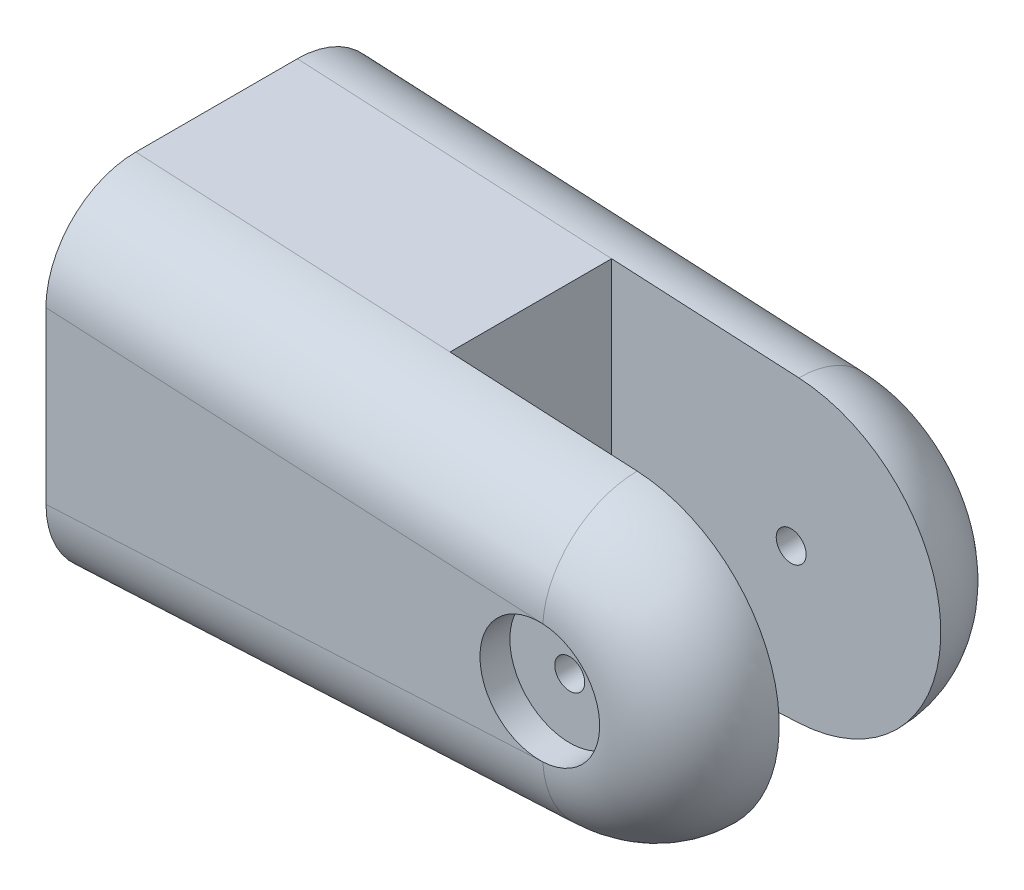
ISO-10303-21;
HEADER;
FILE_DESCRIPTION(('STEP AP214'),'2;1');
FILE_NAME('part.step','',(''),(''),'','','');
FILE_SCHEMA(('AUTOMOTIVE_DESIGN { 1 0 10303 214 1 1 1 1 }'));
ENDSEC;
DATA;
#1=APPLICATION_CONTEXT('core data for automotive mechanical design processes');
#2=APPLICATION_PROTOCOL_DEFINITION('international standard','automotive_design',2000,#1);
#3=PRODUCT_CONTEXT('',#1,'mechanical');
#4=PRODUCT('Part','Part','',(#3));
#5=PRODUCT_RELATED_PRODUCT_CATEGORY('part','',(#4));
#6=PRODUCT_DEFINITION_FORMATION('','',#4);
#7=PRODUCT_DEFINITION_CONTEXT('part definition',#1,'design');
#8=PRODUCT_DEFINITION('design','',#6,#7);
#9=PRODUCT_DEFINITION_SHAPE('','',#8);
#10=(LENGTH_UNIT() NAMED_UNIT(*) SI_UNIT(.MILLI.,.METRE.));
#11=(NAMED_UNIT(*) PLANE_ANGLE_UNIT() SI_UNIT($,.RADIAN.));
#12=(NAMED_UNIT(*) SI_UNIT($,.STERADIAN.) SOLID_ANGLE_UNIT());
#13=UNCERTAINTY_MEASURE_WITH_UNIT(LENGTH_MEASURE(1.E-05),#10,'distance_accuracy_value','');
#14=(GEOMETRIC_REPRESENTATION_CONTEXT(3) GLOBAL_UNCERTAINTY_ASSIGNED_CONTEXT((#13)) GLOBAL_UNIT_ASSIGNED_CONTEXT((#10,
#11,#12)) REPRESENTATION_CONTEXT('',''));
#15=CARTESIAN_POINT('',(0.,0.,0.));
#16=DIRECTION('',(0.,0.,1.));
#17=DIRECTION('',(1.,0.,0.));
#18=AXIS2_PLACEMENT_3D('',#15,#16,#17);
#19=CARTESIAN_POINT('',(0.,0.,57.));
#20=DIRECTION('',(0.,0.,1.));
#21=DIRECTION('',(1.,0.,0.));
#22=AXIS2_PLACEMENT_3D('',#19,#20,#21);
#23=PLANE('',#22);
#24=DIRECTION('',(0.998695955114359,0.0510528083284243,0.));
#25=VECTOR('',#24,1.);
#26=CARTESIAN_POINT('',(1.02105616656849,-19.9739191022872,57.));
#27=LINE('',#26,#25);
#28=CARTESIAN_POINT('',(-165.,-28.4608275708249,57.));
#29=VERTEX_POINT('',#28);
#30=CARTESIAN_POINT('',(1.02105616656849,-19.9739191022872,57.));
#31=VERTEX_POINT('',#30);
#32=EDGE_CURVE('E130',#29,#31,#27,.T.);
#33=ORIENTED_EDGE('',*,*,#32,.T.);
#34=CARTESIAN_POINT('',(0.,0.,57.));
#35=DIRECTION('',(0.,0.,-1.));
#36=DIRECTION('',(-1.,0.,0.));
#37=AXIS2_PLACEMENT_3D('',#34,#35,#36);
#38=CIRCLE('',#37,20.);
#39=CARTESIAN_POINT('',(1.02105616656848,19.9739191022872,57.));
#40=VERTEX_POINT('',#39);
#41=EDGE_CURVE('E116',#31,#40,#38,.T.);
#42=ORIENTED_EDGE('',*,*,#41,.T.);
#43=DIRECTION('',(-0.998695955114359,0.0510528083284241,0.));
#44=VECTOR('',#43,1.);
#45=CARTESIAN_POINT('',(-166.531584249853,28.5391213465692,57.));
#46=LINE('',#45,#44);
#47=CARTESIAN_POINT('',(-165.,28.4608275708248,57.));
#48=VERTEX_POINT('',#47);
#49=EDGE_CURVE('E122',#40,#48,#46,.T.);
#50=ORIENTED_EDGE('',*,*,#49,.T.);
#51=DIRECTION('',(0.,-1.,0.));
#52=VECTOR('',#51,1.);
#53=CARTESIAN_POINT('',(-165.,-58.5,57.));
#54=LINE('',#53,#52);
#55=EDGE_CURVE('E192',#48,#29,#54,.T.);
#56=ORIENTED_EDGE('',*,*,#55,.T.);
#57=EDGE_LOOP('',(#33,#42,#50,#56));
#58=FACE_BOUND('',#57,.T.);
#59=ADVANCED_FACE('F35',(#58),#23,.T.);
#60=CARTESIAN_POINT('',(2.5526404164212,49.9347977557179,57.));
#61=DIRECTION('',(-0.0510528083284241,-0.998695955114359,0.));
#62=DIRECTION('',(0.998695955114359,-0.0510528083284241,0.));
#63=AXIS2_PLACEMENT_3D('',#60,#61,#62);
#64=PLANE('',#63);
#65=DIRECTION('',(0.,0.,-1.));
#66=VECTOR('',#65,1.);
#67=CARTESIAN_POINT('',(-60.,53.1324556067009,57.));
#68=LINE('',#67,#66);
#69=CARTESIAN_POINT('',(-60.,53.1324556067009,27.));
#70=VERTEX_POINT('',#69);
#71=CARTESIAN_POINT('',(-60.,53.1324556067009,-27.));
#72=VERTEX_POINT('',#71);
#73=EDGE_CURVE('E176',#70,#72,#68,.T.);
#74=ORIENTED_EDGE('',*,*,#73,.T.);
#75=DIRECTION('',(-0.998695955114359,0.0510528083284241,0.));
#76=VECTOR('',#75,1.);
#77=CARTESIAN_POINT('',(2.5526404164212,49.9347977557179,-27.));
#78=LINE('',#77,#76);
#79=CARTESIAN_POINT('',(-165.,58.5,-27.));
#80=VERTEX_POINT('',#79);
#81=EDGE_CURVE('E12',#72,#80,#78,.T.);
#82=ORIENTED_EDGE('',*,*,#81,.T.);
#83=DIRECTION('',(0.,0.,-1.));
#84=VECTOR('',#83,1.);
#85=CARTESIAN_POINT('',(-165.,58.5,57.));
#86=LINE('',#85,#84);
#87=CARTESIAN_POINT('',(-165.,58.5,27.));
#88=VERTEX_POINT('',#87);
#89=EDGE_CURVE('E191',#88,#80,#86,.T.);
#90=ORIENTED_EDGE('',*,*,#89,.F.);
#91=DIRECTION('',(-0.998695955114359,0.0510528083284241,0.));
#92=VECTOR('',#91,1.);
#93=CARTESIAN_POINT('',(2.5526404164212,49.9347977557179,27.));
#94=LINE('',#93,#92);
#95=EDGE_CURVE('E44',#88,#70,#94,.F.);
#96=ORIENTED_EDGE('',*,*,#95,.T.);
#97=EDGE_LOOP('',(#74,#82,#90,#96));
#98=FACE_BOUND('',#97,.T.);
#99=ADVANCED_FACE('F224',(#98),#64,.F.);
#100=CARTESIAN_POINT('',(-165.,-58.5,57.));
#101=DIRECTION('',(1.,0.,0.));
#102=DIRECTION('',(0.,0.,-1.));
#103=AXIS2_PLACEMENT_3D('',#100,#101,#102);
#104=PLANE('',#103);
#105=CARTESIAN_POINT('',(-165.,0.,0.));
#106=DIRECTION('',(-1.,0.,0.));
#107=DIRECTION('',(0.,0.,1.));
#108=AXIS2_PLACEMENT_3D('',#105,#106,#107);
#109=CIRCLE('',#108,37.5);
#110=CARTESIAN_POINT('',(-165.,0.,37.5));
#111=VERTEX_POINT('',#110);
#112=EDGE_CURVE('E187',#111,#111,#109,.T.);
#113=ORIENTED_EDGE('',*,*,#112,.F.);
#114=EDGE_LOOP('',(#113));
#115=FACE_BOUND('',#114,.T.);
#116=DIRECTION('',(0.,0.,-1.));
#117=VECTOR('',#116,1.);
#118=CARTESIAN_POINT('',(-165.,-58.5,57.));
#119=LINE('',#118,#117);
#120=CARTESIAN_POINT('',(-165.,-58.5,27.));
#121=VERTEX_POINT('',#120);
#122=CARTESIAN_POINT('',(-165.,-58.5,-27.));
#123=VERTEX_POINT('',#122);
#124=EDGE_CURVE('E194',#121,#123,#119,.T.);
#125=ORIENTED_EDGE('',*,*,#124,.F.);
#126=CARTESIAN_POINT('',(-165.,-28.4608275708249,27.));
#127=DIRECTION('',(1.,0.,0.));
#128=DIRECTION('',(0.,-1.,0.));
#129=AXIS2_PLACEMENT_3D('',#126,#127,#128);
#130=ELLIPSE('',#129,30.0391724291752,30.);
#131=EDGE_CURVE('E217',#121,#29,#130,.F.);
#132=ORIENTED_EDGE('',*,*,#131,.T.);
#133=ORIENTED_EDGE('',*,*,#55,.F.);
#134=CARTESIAN_POINT('',(-165.,28.4608275708248,27.));
#135=DIRECTION('',(1.,0.,0.));
#136=DIRECTION('',(0.,-1.,0.));
#137=AXIS2_PLACEMENT_3D('',#134,#135,#136);
#138=ELLIPSE('',#137,30.0391724291752,30.);
#139=EDGE_CURVE('E142',#48,#88,#138,.F.);
#140=ORIENTED_EDGE('',*,*,#139,.T.);
#141=ORIENTED_EDGE('',*,*,#89,.T.);
#142=CARTESIAN_POINT('',(-165.,28.4608275708248,-27.));
#143=DIRECTION('',(1.,0.,0.));
#144=DIRECTION('',(0.,1.,0.));
#145=AXIS2_PLACEMENT_3D('',#142,#143,#144);
#146=ELLIPSE('',#145,30.0391724291752,30.);
#147=CARTESIAN_POINT('',(-165.,28.4608275708248,-57.));
#148=VERTEX_POINT('',#147);
#149=EDGE_CURVE('E213',#80,#148,#146,.F.);
#150=ORIENTED_EDGE('',*,*,#149,.T.);
#151=DIRECTION('',(0.,-1.,0.));
#152=VECTOR('',#151,1.);
#153=CARTESIAN_POINT('',(-165.,-58.5,-57.));
#154=LINE('',#153,#152);
#155=CARTESIAN_POINT('',(-165.,-28.4608275708249,-57.));
#156=VERTEX_POINT('',#155);
#157=EDGE_CURVE('E186',#148,#156,#154,.T.);
#158=ORIENTED_EDGE('',*,*,#157,.T.);
#159=CARTESIAN_POINT('',(-165.,-28.4608275708249,-27.));
#160=DIRECTION('',(1.,0.,0.));
#161=DIRECTION('',(0.,1.,0.));
#162=AXIS2_PLACEMENT_3D('',#159,#160,#161);
#163=ELLIPSE('',#162,30.0391724291752,30.);
#164=EDGE_CURVE('E215',#156,#123,#163,.F.);
#165=ORIENTED_EDGE('',*,*,#164,.T.);
#166=EDGE_LOOP('',(#125,#132,#133,#140,#141,#150,#158,#165));
#167=FACE_BOUND('',#166,.T.);
#168=ADVANCED_FACE('F274',(#115,#167),#104,.F.);
#169=CARTESIAN_POINT('',(2.55264041642122,-49.9347977557179,57.));
#170=DIRECTION('',(-0.0510528083284243,0.998695955114359,0.));
#171=DIRECTION('',(-0.998695955114359,-0.0510528083284243,0.));
#172=AXIS2_PLACEMENT_3D('',#169,#170,#171);
#173=PLANE('',#172);
#174=DIRECTION('',(0.,0.,1.));
#175=VECTOR('',#174,1.);
#176=CARTESIAN_POINT('',(-60.,-53.1324556067009,57.));
#177=LINE('',#176,#175);
#178=CARTESIAN_POINT('',(-60.,-53.1324556067009,-27.));
#179=VERTEX_POINT('',#178);
#180=CARTESIAN_POINT('',(-60.,-53.1324556067009,27.));
#181=VERTEX_POINT('',#180);
#182=EDGE_CURVE('E202',#179,#181,#177,.T.);
#183=ORIENTED_EDGE('',*,*,#182,.T.);
#184=DIRECTION('',(0.998695955114359,0.0510528083284243,0.));
#185=VECTOR('',#184,1.);
#186=CARTESIAN_POINT('',(-165.,-58.5,27.));
#187=LINE('',#186,#185);
#188=EDGE_CURVE('E210',#181,#121,#187,.F.);
#189=ORIENTED_EDGE('',*,*,#188,.T.);
#190=ORIENTED_EDGE('',*,*,#124,.T.);
#191=DIRECTION('',(0.998695955114359,0.0510528083284243,0.));
#192=VECTOR('',#191,1.);
#193=CARTESIAN_POINT('',(2.55264041642122,-49.9347977557179,-27.));
#194=LINE('',#193,#192);
#195=EDGE_CURVE('E207',#123,#179,#194,.T.);
#196=ORIENTED_EDGE('',*,*,#195,.T.);
#197=EDGE_LOOP('',(#183,#189,#190,#196));
#198=FACE_BOUND('',#197,.T.);
#199=ADVANCED_FACE('F283',(#198),#173,.F.);
#200=CARTESIAN_POINT('',(0.,0.,-57.));
#201=DIRECTION('',(0.,0.,1.));
#202=DIRECTION('',(1.,0.,0.));
#203=AXIS2_PLACEMENT_3D('',#200,#201,#202);
#204=PLANE('',#203);
#205=DIRECTION('',(-0.998695955114359,0.0510528083284241,0.));
#206=VECTOR('',#205,1.);
#207=CARTESIAN_POINT('',(1.02105616656848,19.9739191022872,-57.));
#208=LINE('',#207,#206);
#209=CARTESIAN_POINT('',(1.02105616656848,19.9739191022872,-57.));
#210=VERTEX_POINT('',#209);
#211=EDGE_CURVE('E171',#148,#210,#208,.F.);
#212=ORIENTED_EDGE('',*,*,#211,.T.);
#213=CARTESIAN_POINT('',(0.,0.,-57.));
#214=DIRECTION('',(0.,0.,-1.));
#215=DIRECTION('',(-1.,0.,0.));
#216=AXIS2_PLACEMENT_3D('',#213,#214,#215);
#217=CIRCLE('',#216,20.);
#218=CARTESIAN_POINT('',(1.02105616656849,-19.9739191022872,-57.));
#219=VERTEX_POINT('',#218);
#220=EDGE_CURVE('E51',#219,#210,#217,.T.);
#221=ORIENTED_EDGE('',*,*,#220,.F.);
#222=DIRECTION('',(0.998695955114359,0.0510528083284243,0.));
#223=VECTOR('',#222,1.);
#224=CARTESIAN_POINT('',(1.02105616656849,-19.9739191022872,-57.));
#225=LINE('',#224,#223);
#226=EDGE_CURVE('E221',#219,#156,#225,.F.);
#227=ORIENTED_EDGE('',*,*,#226,.T.);
#228=ORIENTED_EDGE('',*,*,#157,.F.);
#229=EDGE_LOOP('',(#212,#221,#227,#228));
#230=FACE_BOUND('',#229,.T.);
#231=ADVANCED_FACE('F280',(#230),#204,.F.);
#232=CARTESIAN_POINT('',(-167.,0.,0.));
#233=DIRECTION('',(1.,0.,0.));
#234=DIRECTION('',(0.,0.,-1.));
#235=AXIS2_PLACEMENT_3D('',#232,#233,#234);
#236=CYLINDRICAL_SURFACE('',#235,37.5);
#237=CARTESIAN_POINT('',(-167.,0.,0.));
#238=DIRECTION('',(-1.,0.,0.));
#239=DIRECTION('',(0.,0.,1.));
#240=AXIS2_PLACEMENT_3D('',#237,#238,#239);
#241=CIRCLE('',#240,37.5);
#242=CARTESIAN_POINT('',(-167.,0.,37.5));
#243=VERTEX_POINT('',#242);
#244=EDGE_CURVE('E178',#243,#243,#241,.T.);
#245=ORIENTED_EDGE('',*,*,#244,.F.);
#246=EDGE_LOOP('',(#245));
#247=FACE_BOUND('',#246,.T.);
#248=ORIENTED_EDGE('',*,*,#112,.T.);
#249=EDGE_LOOP('',(#248));
#250=FACE_BOUND('',#249,.T.);
#251=ADVANCED_FACE('F278',(#247,#250),#236,.T.);
#252=CARTESIAN_POINT('',(-167.,0.,0.));
#253=DIRECTION('',(-1.,0.,0.));
#254=DIRECTION('',(0.,0.,1.));
#255=AXIS2_PLACEMENT_3D('',#252,#253,#254);
#256=PLANE('',#255);
#257=ORIENTED_EDGE('',*,*,#244,.T.);
#258=EDGE_LOOP('',(#257));
#259=FACE_BOUND('',#258,.T.);
#260=ADVANCED_FACE('F343',(#259),#256,.T.);
#261=CARTESIAN_POINT('',(-60.,-58.5,0.));
#262=DIRECTION('',(-1.,0.,0.));
#263=DIRECTION('',(0.,0.,1.));
#264=AXIS2_PLACEMENT_3D('',#261,#262,#263);
#265=PLANE('',#264);
#266=DIRECTION('',(0.,1.,0.));
#267=VECTOR('',#266,1.);
#268=CARTESIAN_POINT('',(-60.,-58.5,27.));
#269=LINE('',#268,#267);
#270=EDGE_CURVE('E146',#181,#70,#269,.T.);
#271=ORIENTED_EDGE('',*,*,#270,.F.);
#272=ORIENTED_EDGE('',*,*,#182,.F.);
#273=DIRECTION('',(0.,1.,0.));
#274=VECTOR('',#273,1.);
#275=CARTESIAN_POINT('',(-60.,-58.5,-27.));
#276=LINE('',#275,#274);
#277=EDGE_CURVE('E150',#179,#72,#276,.T.);
#278=ORIENTED_EDGE('',*,*,#277,.T.);
#279=ORIENTED_EDGE('',*,*,#73,.F.);
#280=EDGE_LOOP('',(#271,#272,#278,#279));
#281=FACE_BOUND('',#280,.T.);
#282=ADVANCED_FACE('F227',(#281),#265,.F.);
#283=CARTESIAN_POINT('',(0.,-58.5,-27.));
#284=DIRECTION('',(0.,0.,-1.));
#285=DIRECTION('',(-1.,0.,0.));
#286=AXIS2_PLACEMENT_3D('',#283,#284,#285);
#287=PLANE('',#286);
#288=CARTESIAN_POINT('',(0.,0.,-27.));
#289=DIRECTION('',(0.,0.,-1.));
#290=DIRECTION('',(-1.,0.,0.));
#291=AXIS2_PLACEMENT_3D('',#288,#289,#290);
#292=CIRCLE('',#291,5.);
#293=CARTESIAN_POINT('',(-5.,0.,-27.));
#294=VERTEX_POINT('',#293);
#295=EDGE_CURVE('E132',#294,#294,#292,.T.);
#296=ORIENTED_EDGE('',*,*,#295,.T.);
#297=EDGE_LOOP('',(#296));
#298=FACE_BOUND('',#297,.T.);
#299=ORIENTED_EDGE('',*,*,#277,.F.);
#300=DIRECTION('',(-0.998695955114359,-0.0510528083284243,0.));
#301=VECTOR('',#300,1.);
#302=CARTESIAN_POINT('',(2.5526404164212,-49.9347977557179,-27.));
#303=LINE('',#302,#301);
#304=CARTESIAN_POINT('',(2.55264041642122,-49.9347977557179,-27.));
#305=VERTEX_POINT('',#304);
#306=EDGE_CURVE('E123',#305,#179,#303,.T.);
#307=ORIENTED_EDGE('',*,*,#306,.F.);
#308=CARTESIAN_POINT('',(0.,0.,-27.));
#309=DIRECTION('',(0.,0.,-1.));
#310=DIRECTION('',(-1.,0.,0.));
#311=AXIS2_PLACEMENT_3D('',#308,#309,#310);
#312=CIRCLE('',#311,50.);
#313=CARTESIAN_POINT('',(2.5526404164212,49.9347977557179,-27.));
#314=VERTEX_POINT('',#313);
#315=EDGE_CURVE('E165',#314,#305,#312,.T.);
#316=ORIENTED_EDGE('',*,*,#315,.F.);
#317=DIRECTION('',(0.998695955114359,-0.0510528083284241,0.));
#318=VECTOR('',#317,1.);
#319=CARTESIAN_POINT('',(2.55264041642119,49.9347977557179,-27.));
#320=LINE('',#319,#318);
#321=EDGE_CURVE('E172',#72,#314,#320,.T.);
#322=ORIENTED_EDGE('',*,*,#321,.F.);
#323=EDGE_LOOP('',(#299,#307,#316,#322));
#324=FACE_BOUND('',#323,.T.);
#325=ADVANCED_FACE('F327',(#298,#324),#287,.F.);
#326=CARTESIAN_POINT('',(0.,-58.5,27.));
#327=DIRECTION('',(0.,0.,1.));
#328=DIRECTION('',(1.,0.,0.));
#329=AXIS2_PLACEMENT_3D('',#326,#327,#328);
#330=PLANE('',#329);
#331=CARTESIAN_POINT('',(0.,0.,27.));
#332=DIRECTION('',(0.,0.,1.));
#333=DIRECTION('',(1.,0.,0.));
#334=AXIS2_PLACEMENT_3D('',#331,#332,#333);
#335=CIRCLE('',#334,5.);
#336=CARTESIAN_POINT('',(5.,0.,27.));
#337=VERTEX_POINT('',#336);
#338=EDGE_CURVE('E241',#337,#337,#335,.T.);
#339=ORIENTED_EDGE('',*,*,#338,.T.);
#340=EDGE_LOOP('',(#339));
#341=FACE_BOUND('',#340,.T.);
#342=CARTESIAN_POINT('',(0.,0.,27.));
#343=DIRECTION('',(0.,0.,1.));
#344=DIRECTION('',(1.,0.,0.));
#345=AXIS2_PLACEMENT_3D('',#342,#343,#344);
#346=CIRCLE('',#345,50.);
#347=CARTESIAN_POINT('',(2.55264041642122,-49.9347977557179,27.));
#348=VERTEX_POINT('',#347);
#349=CARTESIAN_POINT('',(2.5526404164212,49.9347977557179,27.));
#350=VERTEX_POINT('',#349);
#351=EDGE_CURVE('E145',#348,#350,#346,.T.);
#352=ORIENTED_EDGE('',*,*,#351,.F.);
#353=DIRECTION('',(0.998695955114359,0.0510528083284243,0.));
#354=VECTOR('',#353,1.);
#355=CARTESIAN_POINT('',(2.55264041642122,-49.9347977557179,27.));
#356=LINE('',#355,#354);
#357=EDGE_CURVE('E190',#181,#348,#356,.T.);
#358=ORIENTED_EDGE('',*,*,#357,.F.);
#359=ORIENTED_EDGE('',*,*,#270,.T.);
#360=DIRECTION('',(-0.998695955114359,0.0510528083284241,0.));
#361=VECTOR('',#360,1.);
#362=CARTESIAN_POINT('',(2.5526404164212,49.9347977557179,27.));
#363=LINE('',#362,#361);
#364=EDGE_CURVE('E180',#350,#70,#363,.T.);
#365=ORIENTED_EDGE('',*,*,#364,.F.);
#366=EDGE_LOOP('',(#352,#358,#359,#365));
#367=FACE_BOUND('',#366,.T.);
#368=ADVANCED_FACE('F230',(#341,#367),#330,.F.);
#369=CARTESIAN_POINT('',(1.02105616656848,19.9739191022872,27.));
#370=DIRECTION('',(0.998695955114359,-0.0510528083284241,0.));
#371=DIRECTION('',(0.0510528083284241,0.998695955114359,0.));
#372=AXIS2_PLACEMENT_3D('',#369,#370,#371);
#373=CYLINDRICAL_SURFACE('',#372,30.);
#374=ORIENTED_EDGE('',*,*,#139,.F.);
#375=ORIENTED_EDGE('',*,*,#49,.F.);
#376=CARTESIAN_POINT('',(1.02105616656848,19.9739191022872,27.));
#377=DIRECTION('',(0.998695955114359,-0.0510528083284241,0.));
#378=DIRECTION('',(0.0510528083284241,0.998695955114359,0.));
#379=AXIS2_PLACEMENT_3D('',#376,#377,#378);
#380=CIRCLE('',#379,30.);
#381=EDGE_CURVE('E139',#350,#40,#380,.T.);
#382=ORIENTED_EDGE('',*,*,#381,.F.);
#383=ORIENTED_EDGE('',*,*,#364,.T.);
#384=ORIENTED_EDGE('',*,*,#95,.F.);
#385=EDGE_LOOP('',(#374,#375,#382,#383,#384));
#386=FACE_BOUND('',#385,.T.);
#387=ADVANCED_FACE('F137',(#386),#373,.T.);
#388=CARTESIAN_POINT('',(0.,0.,27.));
#389=DIRECTION('',(0.,0.,1.));
#390=DIRECTION('',(1.,0.,0.));
#391=AXIS2_PLACEMENT_3D('',#388,#389,#390);
#392=DEGENERATE_TOROIDAL_SURFACE('',#391,20.,30.,.T.);
#393=ORIENTED_EDGE('',*,*,#381,.T.);
#394=CARTESIAN_POINT('',(0.,0.,57.));
#395=DIRECTION('',(0.,0.,1.));
#396=DIRECTION('',(1.,0.,0.));
#397=AXIS2_PLACEMENT_3D('',#394,#395,#396);
#398=CIRCLE('',#397,20.);
#399=EDGE_CURVE('E113',#31,#40,#398,.T.);
#400=ORIENTED_EDGE('',*,*,#399,.F.);
#401=CARTESIAN_POINT('',(1.02105616656849,-19.9739191022872,27.));
#402=DIRECTION('',(-0.998695955114359,-0.0510528083284243,0.));
#403=DIRECTION('',(0.0510528083284243,-0.998695955114359,0.));
#404=AXIS2_PLACEMENT_3D('',#401,#402,#403);
#405=CIRCLE('',#404,30.);
#406=EDGE_CURVE('E147',#348,#31,#405,.T.);
#407=ORIENTED_EDGE('',*,*,#406,.F.);
#408=ORIENTED_EDGE('',*,*,#351,.T.);
#409=EDGE_LOOP('',(#393,#400,#407,#408));
#410=FACE_BOUND('',#409,.T.);
#411=ADVANCED_FACE('F144',(#410),#392,.T.);
#412=CARTESIAN_POINT('',(1.02105616656849,-19.9739191022872,27.));
#413=DIRECTION('',(-0.998695955114359,-0.0510528083284243,0.));
#414=DIRECTION('',(0.0510528083284243,-0.998695955114359,0.));
#415=AXIS2_PLACEMENT_3D('',#412,#413,#414);
#416=CYLINDRICAL_SURFACE('',#415,30.);
#417=ORIENTED_EDGE('',*,*,#188,.F.);
#418=ORIENTED_EDGE('',*,*,#357,.T.);
#419=ORIENTED_EDGE('',*,*,#406,.T.);
#420=ORIENTED_EDGE('',*,*,#32,.F.);
#421=ORIENTED_EDGE('',*,*,#131,.F.);
#422=EDGE_LOOP('',(#417,#418,#419,#420,#421));
#423=FACE_BOUND('',#422,.T.);
#424=ADVANCED_FACE('F291',(#423),#416,.T.);
#425=CARTESIAN_POINT('',(1.02105616656848,19.9739191022872,-27.));
#426=DIRECTION('',(-0.998695955114359,0.0510528083284241,0.));
#427=DIRECTION('',(-0.0510528083284241,-0.998695955114359,0.));
#428=AXIS2_PLACEMENT_3D('',#425,#426,#427);
#429=CYLINDRICAL_SURFACE('',#428,30.);
#430=ORIENTED_EDGE('',*,*,#81,.F.);
#431=ORIENTED_EDGE('',*,*,#321,.T.);
#432=CARTESIAN_POINT('',(1.02105616656848,19.9739191022872,-27.));
#433=DIRECTION('',(0.998695955114359,-0.0510528083284241,0.));
#434=DIRECTION('',(0.0510528083284241,0.998695955114359,0.));
#435=AXIS2_PLACEMENT_3D('',#432,#433,#434);
#436=CIRCLE('',#435,30.);
#437=EDGE_CURVE('E152',#210,#314,#436,.T.);
#438=ORIENTED_EDGE('',*,*,#437,.F.);
#439=ORIENTED_EDGE('',*,*,#211,.F.);
#440=ORIENTED_EDGE('',*,*,#149,.F.);
#441=EDGE_LOOP('',(#430,#431,#438,#439,#440));
#442=FACE_BOUND('',#441,.T.);
#443=ADVANCED_FACE('F37',(#442),#429,.T.);
#444=CARTESIAN_POINT('',(0.,0.,-27.));
#445=DIRECTION('',(0.,0.,1.));
#446=DIRECTION('',(1.,0.,0.));
#447=AXIS2_PLACEMENT_3D('',#444,#445,#446);
#448=DEGENERATE_TOROIDAL_SURFACE('',#447,20.,30.,.T.);
#449=ORIENTED_EDGE('',*,*,#437,.T.);
#450=ORIENTED_EDGE('',*,*,#315,.T.);
#451=CARTESIAN_POINT('',(1.02105616656849,-19.9739191022872,-27.));
#452=DIRECTION('',(-0.998695955114359,-0.0510528083284243,0.));
#453=DIRECTION('',(0.0510528083284243,-0.998695955114359,0.));
#454=AXIS2_PLACEMENT_3D('',#451,#452,#453);
#455=CIRCLE('',#454,30.);
#456=EDGE_CURVE('E155',#219,#305,#455,.T.);
#457=ORIENTED_EDGE('',*,*,#456,.F.);
#458=CARTESIAN_POINT('',(0.,0.,-57.));
#459=DIRECTION('',(0.,0.,1.));
#460=DIRECTION('',(1.,0.,0.));
#461=AXIS2_PLACEMENT_3D('',#458,#459,#460);
#462=CIRCLE('',#461,20.);
#463=EDGE_CURVE('E166',#210,#219,#462,.F.);
#464=ORIENTED_EDGE('',*,*,#463,.F.);
#465=EDGE_LOOP('',(#449,#450,#457,#464));
#466=FACE_BOUND('',#465,.T.);
#467=ADVANCED_FACE('F163',(#466),#448,.T.);
#468=CARTESIAN_POINT('',(1.02105616656849,-19.9739191022872,-27.));
#469=DIRECTION('',(0.998695955114359,0.0510528083284243,0.));
#470=DIRECTION('',(-0.0510528083284243,0.998695955114359,0.));
#471=AXIS2_PLACEMENT_3D('',#468,#469,#470);
#472=CYLINDRICAL_SURFACE('',#471,30.);
#473=ORIENTED_EDGE('',*,*,#164,.F.);
#474=ORIENTED_EDGE('',*,*,#226,.F.);
#475=ORIENTED_EDGE('',*,*,#456,.T.);
#476=ORIENTED_EDGE('',*,*,#306,.T.);
#477=ORIENTED_EDGE('',*,*,#195,.F.);
#478=EDGE_LOOP('',(#473,#474,#475,#476,#477));
#479=FACE_BOUND('',#478,.T.);
#480=ADVANCED_FACE('F299',(#479),#472,.T.);
#481=CARTESIAN_POINT('',(0.,0.,-47.));
#482=DIRECTION('',(0.,0.,-1.));
#483=DIRECTION('',(-1.,0.,0.));
#484=AXIS2_PLACEMENT_3D('',#481,#482,#483);
#485=CYLINDRICAL_SURFACE('',#484,20.);
#486=CARTESIAN_POINT('',(0.,0.,-47.));
#487=DIRECTION('',(0.,0.,-1.));
#488=DIRECTION('',(-1.,0.,0.));
#489=AXIS2_PLACEMENT_3D('',#486,#487,#488);
#490=CIRCLE('',#489,20.);
#491=CARTESIAN_POINT('',(-20.,0.,-47.));
#492=VERTEX_POINT('',#491);
#493=EDGE_CURVE('E157',#492,#492,#490,.T.);
#494=ORIENTED_EDGE('',*,*,#493,.F.);
#495=EDGE_LOOP('',(#494));
#496=FACE_BOUND('',#495,.T.);
#497=ORIENTED_EDGE('',*,*,#463,.T.);
#498=ORIENTED_EDGE('',*,*,#220,.T.);
#499=EDGE_LOOP('',(#497,#498));
#500=FACE_BOUND('',#499,.T.);
#501=ADVANCED_FACE('F266',(#496,#500),#485,.F.);
#502=CARTESIAN_POINT('',(0.,0.,-47.));
#503=DIRECTION('',(0.,0.,-1.));
#504=DIRECTION('',(-1.,0.,0.));
#505=AXIS2_PLACEMENT_3D('',#502,#503,#504);
#506=PLANE('',#505);
#507=CARTESIAN_POINT('',(0.,0.,-47.));
#508=DIRECTION('',(0.,0.,-1.));
#509=DIRECTION('',(-1.,0.,0.));
#510=AXIS2_PLACEMENT_3D('',#507,#508,#509);
#511=CIRCLE('',#510,5.);
#512=CARTESIAN_POINT('',(-5.,0.,-47.));
#513=VERTEX_POINT('',#512);
#514=EDGE_CURVE('E244',#513,#513,#511,.T.);
#515=ORIENTED_EDGE('',*,*,#514,.F.);
#516=EDGE_LOOP('',(#515));
#517=FACE_BOUND('',#516,.T.);
#518=ORIENTED_EDGE('',*,*,#493,.T.);
#519=EDGE_LOOP('',(#518));
#520=FACE_BOUND('',#519,.T.);
#521=ADVANCED_FACE('F261',(#517,#520),#506,.T.);
#522=CARTESIAN_POINT('',(0.,0.,47.));
#523=DIRECTION('',(0.,0.,1.));
#524=DIRECTION('',(1.,0.,0.));
#525=AXIS2_PLACEMENT_3D('',#522,#523,#524);
#526=CYLINDRICAL_SURFACE('',#525,20.);
#527=CARTESIAN_POINT('',(0.,0.,47.));
#528=DIRECTION('',(0.,0.,-1.));
#529=DIRECTION('',(-1.,0.,0.));
#530=AXIS2_PLACEMENT_3D('',#527,#528,#529);
#531=CIRCLE('',#530,20.);
#532=CARTESIAN_POINT('',(-20.,0.,47.));
#533=VERTEX_POINT('',#532);
#534=EDGE_CURVE('E131',#533,#533,#531,.T.);
#535=ORIENTED_EDGE('',*,*,#534,.T.);
#536=EDGE_LOOP('',(#535));
#537=FACE_BOUND('',#536,.T.);
#538=ORIENTED_EDGE('',*,*,#399,.T.);
#539=ORIENTED_EDGE('',*,*,#41,.F.);
#540=EDGE_LOOP('',(#538,#539));
#541=FACE_BOUND('',#540,.T.);
#542=ADVANCED_FACE('F115',(#537,#541),#526,.F.);
#543=CARTESIAN_POINT('',(0.,0.,47.));
#544=DIRECTION('',(0.,0.,1.));
#545=DIRECTION('',(-1.,0.,0.));
#546=AXIS2_PLACEMENT_3D('',#543,#544,#545);
#547=PLANE('',#546);
#548=CARTESIAN_POINT('',(0.,0.,47.));
#549=DIRECTION('',(0.,0.,1.));
#550=DIRECTION('',(1.,0.,0.));
#551=AXIS2_PLACEMENT_3D('',#548,#549,#550);
#552=CIRCLE('',#551,5.);
#553=CARTESIAN_POINT('',(5.,0.,47.));
#554=VERTEX_POINT('',#553);
#555=EDGE_CURVE('E39',#554,#554,#552,.T.);
#556=ORIENTED_EDGE('',*,*,#555,.F.);
#557=EDGE_LOOP('',(#556));
#558=FACE_BOUND('',#557,.T.);
#559=ORIENTED_EDGE('',*,*,#534,.F.);
#560=EDGE_LOOP('',(#559));
#561=FACE_BOUND('',#560,.T.);
#562=ADVANCED_FACE('F254',(#558,#561),#547,.T.);
#563=CARTESIAN_POINT('',(0.,0.,453.));
#564=DIRECTION('',(0.,0.,-1.));
#565=DIRECTION('',(-1.,0.,0.));
#566=AXIS2_PLACEMENT_3D('',#563,#564,#565);
#567=CYLINDRICAL_SURFACE('',#566,5.);
#568=ORIENTED_EDGE('',*,*,#555,.T.);
#569=EDGE_LOOP('',(#568));
#570=FACE_BOUND('',#569,.T.);
#571=ORIENTED_EDGE('',*,*,#338,.F.);
#572=EDGE_LOOP('',(#571));
#573=FACE_BOUND('',#572,.T.);
#574=ADVANCED_FACE('F251',(#570,#573),#567,.F.);
#575=ORIENTED_EDGE('',*,*,#514,.T.);
#576=EDGE_LOOP('',(#575));
#577=FACE_BOUND('',#576,.T.);
#578=ORIENTED_EDGE('',*,*,#295,.F.);
#579=EDGE_LOOP('',(#578));
#580=FACE_BOUND('',#579,.T.);
#581=ADVANCED_FACE('F439',(#577,#580),#567,.F.);
#582=CLOSED_SHELL('',(#59,#99,#168,#199,#231,#251,#260,#282,#325,#368,#387,#411,#424,#443,#467,
#480,#501,#521,#542,#562,#574,#581));
#583=MANIFOLD_SOLID_BREP('B2',#582);
#584=ADVANCED_BREP_SHAPE_REPRESENTATION('',(#18,#583),#14);
#585=SHAPE_DEFINITION_REPRESENTATION(#9,#584);
ENDSEC;
END-ISO-10303-21;
